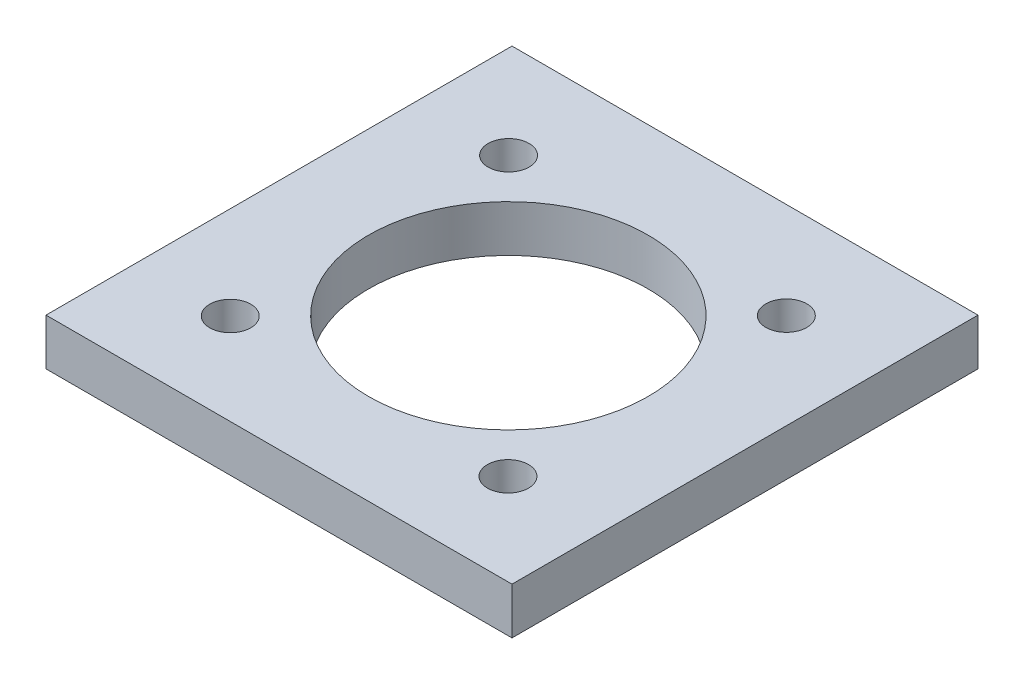
ISO-10303-21;
HEADER;
FILE_DESCRIPTION(('STEP AP214'),'2;1');
FILE_NAME('part.step','',(''),(''),'','','');
FILE_SCHEMA(('AUTOMOTIVE_DESIGN { 1 0 10303 214 1 1 1 1 }'));
ENDSEC;
DATA;
#1=APPLICATION_CONTEXT('core data for automotive mechanical design processes');
#2=APPLICATION_PROTOCOL_DEFINITION('international standard','automotive_design',2000,#1);
#3=PRODUCT_CONTEXT('',#1,'mechanical');
#4=PRODUCT('Part','Part','',(#3));
#5=PRODUCT_RELATED_PRODUCT_CATEGORY('part','',(#4));
#6=PRODUCT_DEFINITION_FORMATION('','',#4);
#7=PRODUCT_DEFINITION_CONTEXT('part definition',#1,'design');
#8=PRODUCT_DEFINITION('design','',#6,#7);
#9=PRODUCT_DEFINITION_SHAPE('','',#8);
#10=(LENGTH_UNIT() NAMED_UNIT(*) SI_UNIT(.MILLI.,.METRE.));
#11=(NAMED_UNIT(*) PLANE_ANGLE_UNIT() SI_UNIT($,.RADIAN.));
#12=(NAMED_UNIT(*) SI_UNIT($,.STERADIAN.) SOLID_ANGLE_UNIT());
#13=UNCERTAINTY_MEASURE_WITH_UNIT(LENGTH_MEASURE(1.E-05),#10,'distance_accuracy_value','');
#14=(GEOMETRIC_REPRESENTATION_CONTEXT(3) GLOBAL_UNCERTAINTY_ASSIGNED_CONTEXT((#13)) GLOBAL_UNIT_ASSIGNED_CONTEXT((#10,
#11,#12)) REPRESENTATION_CONTEXT('',''));
#15=CARTESIAN_POINT('',(0.,0.,0.));
#16=DIRECTION('',(0.,0.,1.));
#17=DIRECTION('',(1.,0.,0.));
#18=AXIS2_PLACEMENT_3D('',#15,#16,#17);
#19=CARTESIAN_POINT('',(0.,5.,0.));
#20=DIRECTION('',(0.,-1.,0.));
#21=DIRECTION('',(0.,0.,-1.));
#22=AXIS2_PLACEMENT_3D('',#19,#20,#21);
#23=PLANE('',#22);
#24=CARTESIAN_POINT('',(14.7671997765636,5.,-14.6675996089863));
#25=DIRECTION('',(0.,1.,0.));
#26=DIRECTION('',(0.,0.,1.));
#27=AXIS2_PLACEMENT_3D('',#24,#25,#26);
#28=CIRCLE('',#27,2.19999999999998);
#29=CARTESIAN_POINT('',(14.7671997765636,5.,-12.4675996089864));
#30=VERTEX_POINT('',#29);
#31=EDGE_CURVE('E153',#30,#30,#28,.T.);
#32=ORIENTED_EDGE('',*,*,#31,.F.);
#33=EDGE_LOOP('',(#32));
#34=FACE_BOUND('',#33,.T.);
#35=CARTESIAN_POINT('',(-15.0328002234364,5.,15.1988005027319));
#36=DIRECTION('',(0.,1.,0.));
#37=DIRECTION('',(0.,0.,1.));
#38=AXIS2_PLACEMENT_3D('',#35,#36,#37);
#39=CIRCLE('',#38,2.2);
#40=CARTESIAN_POINT('',(-15.0328002234364,5.,17.3988005027319));
#41=VERTEX_POINT('',#40);
#42=EDGE_CURVE('E160',#41,#41,#39,.T.);
#43=ORIENTED_EDGE('',*,*,#42,.F.);
#44=EDGE_LOOP('',(#43));
#45=FACE_BOUND('',#44,.T.);
#46=CARTESIAN_POINT('',(-0.132800223436359,5.,0.260912254546837));
#47=DIRECTION('',(0.,1.,0.));
#48=DIRECTION('',(0.,0.,1.));
#49=AXIS2_PLACEMENT_3D('',#46,#47,#48);
#50=CIRCLE('',#49,15.);
#51=CARTESIAN_POINT('',(-0.132800223436359,5.,15.2609122545468));
#52=VERTEX_POINT('',#51);
#53=EDGE_CURVE('E156',#52,#52,#50,.T.);
#54=ORIENTED_EDGE('',*,*,#53,.F.);
#55=EDGE_LOOP('',(#54));
#56=FACE_BOUND('',#55,.T.);
#57=DIRECTION('',(-1.,0.,0.));
#58=VECTOR('',#57,1.);
#59=CARTESIAN_POINT('',(25.,5.,-25.));
#60=LINE('',#59,#58);
#61=CARTESIAN_POINT('',(25.,5.,-25.));
#62=VERTEX_POINT('',#61);
#63=CARTESIAN_POINT('',(-25.,5.,-25.));
#64=VERTEX_POINT('',#63);
#65=EDGE_CURVE('E97',#62,#64,#60,.T.);
#66=ORIENTED_EDGE('',*,*,#65,.T.);
#67=DIRECTION('',(0.,0.,-1.));
#68=VECTOR('',#67,1.);
#69=CARTESIAN_POINT('',(-25.,5.,25.));
#70=LINE('',#69,#68);
#71=CARTESIAN_POINT('',(-25.,5.,25.));
#72=VERTEX_POINT('',#71);
#73=EDGE_CURVE('E104',#72,#64,#70,.T.);
#74=ORIENTED_EDGE('',*,*,#73,.F.);
#75=DIRECTION('',(-1.,0.,0.));
#76=VECTOR('',#75,1.);
#77=CARTESIAN_POINT('',(25.,5.,25.));
#78=LINE('',#77,#76);
#79=CARTESIAN_POINT('',(25.,5.,25.));
#80=VERTEX_POINT('',#79);
#81=EDGE_CURVE('E112',#80,#72,#78,.T.);
#82=ORIENTED_EDGE('',*,*,#81,.F.);
#83=DIRECTION('',(0.,0.,-1.));
#84=VECTOR('',#83,1.);
#85=CARTESIAN_POINT('',(25.,5.,25.));
#86=LINE('',#85,#84);
#87=EDGE_CURVE('E74',#80,#62,#86,.T.);
#88=ORIENTED_EDGE('',*,*,#87,.T.);
#89=EDGE_LOOP('',(#66,#74,#82,#88));
#90=FACE_BOUND('',#89,.T.);
#91=CARTESIAN_POINT('',(14.7671997765637,5.,15.1988005027319));
#92=DIRECTION('',(0.,-1.,0.));
#93=DIRECTION('',(0.,0.,-1.));
#94=AXIS2_PLACEMENT_3D('',#91,#92,#93);
#95=CIRCLE('',#94,2.19999999999999);
#96=CARTESIAN_POINT('',(14.7671997765637,5.,12.9988005027319));
#97=VERTEX_POINT('',#96);
#98=EDGE_CURVE('E142',#97,#97,#95,.T.);
#99=ORIENTED_EDGE('',*,*,#98,.T.);
#100=EDGE_LOOP('',(#99));
#101=FACE_BOUND('',#100,.T.);
#102=CARTESIAN_POINT('',(-15.0328002234364,5.,-14.6675996089863));
#103=DIRECTION('',(0.,-1.,0.));
#104=DIRECTION('',(0.,0.,-1.));
#105=AXIS2_PLACEMENT_3D('',#102,#103,#104);
#106=CIRCLE('',#105,2.19999999999999);
#107=CARTESIAN_POINT('',(-15.0328002234364,5.,-16.8675996089863));
#108=VERTEX_POINT('',#107);
#109=EDGE_CURVE('E141',#108,#108,#106,.T.);
#110=ORIENTED_EDGE('',*,*,#109,.T.);
#111=EDGE_LOOP('',(#110));
#112=FACE_BOUND('',#111,.T.);
#113=ADVANCED_FACE('F57',(#34,#45,#56,#90,#101,#112),#23,.F.);
#114=CARTESIAN_POINT('',(0.,0.,0.));
#115=DIRECTION('',(0.,-1.,0.));
#116=DIRECTION('',(0.,0.,-1.));
#117=AXIS2_PLACEMENT_3D('',#114,#115,#116);
#118=PLANE('',#117);
#119=CARTESIAN_POINT('',(14.7671997765636,0.,-14.6675996089863));
#120=DIRECTION('',(0.,1.,0.));
#121=DIRECTION('',(0.,0.,1.));
#122=AXIS2_PLACEMENT_3D('',#119,#120,#121);
#123=CIRCLE('',#122,2.19999999999998);
#124=CARTESIAN_POINT('',(14.7671997765636,0.,-12.4675996089864));
#125=VERTEX_POINT('',#124);
#126=EDGE_CURVE('E157',#125,#125,#123,.T.);
#127=ORIENTED_EDGE('',*,*,#126,.T.);
#128=EDGE_LOOP('',(#127));
#129=FACE_BOUND('',#128,.T.);
#130=CARTESIAN_POINT('',(-15.0328002234364,0.,15.1988005027319));
#131=DIRECTION('',(0.,1.,0.));
#132=DIRECTION('',(0.,0.,1.));
#133=AXIS2_PLACEMENT_3D('',#130,#131,#132);
#134=CIRCLE('',#133,2.2);
#135=CARTESIAN_POINT('',(-15.0328002234364,0.,17.3988005027319));
#136=VERTEX_POINT('',#135);
#137=EDGE_CURVE('E145',#136,#136,#134,.T.);
#138=ORIENTED_EDGE('',*,*,#137,.T.);
#139=EDGE_LOOP('',(#138));
#140=FACE_BOUND('',#139,.T.);
#141=CARTESIAN_POINT('',(14.7671997765637,0.,15.1988005027319));
#142=DIRECTION('',(0.,-1.,0.));
#143=DIRECTION('',(0.,0.,-1.));
#144=AXIS2_PLACEMENT_3D('',#141,#142,#143);
#145=CIRCLE('',#144,2.19999999999999);
#146=CARTESIAN_POINT('',(14.7671997765637,0.,12.9988005027319));
#147=VERTEX_POINT('',#146);
#148=EDGE_CURVE('E148',#147,#147,#145,.T.);
#149=ORIENTED_EDGE('',*,*,#148,.F.);
#150=EDGE_LOOP('',(#149));
#151=FACE_BOUND('',#150,.T.);
#152=CARTESIAN_POINT('',(-0.132800223436359,0.,0.260912254546837));
#153=DIRECTION('',(0.,1.,0.));
#154=DIRECTION('',(0.,0.,1.));
#155=AXIS2_PLACEMENT_3D('',#152,#153,#154);
#156=CIRCLE('',#155,15.);
#157=CARTESIAN_POINT('',(-0.132800223436359,0.,15.2609122545468));
#158=VERTEX_POINT('',#157);
#159=EDGE_CURVE('E123',#158,#158,#156,.T.);
#160=ORIENTED_EDGE('',*,*,#159,.T.);
#161=EDGE_LOOP('',(#160));
#162=FACE_BOUND('',#161,.T.);
#163=DIRECTION('',(-1.,0.,0.));
#164=VECTOR('',#163,1.);
#165=CARTESIAN_POINT('',(25.,0.,-25.));
#166=LINE('',#165,#164);
#167=CARTESIAN_POINT('',(25.,0.,-25.));
#168=VERTEX_POINT('',#167);
#169=CARTESIAN_POINT('',(-25.,0.,-25.));
#170=VERTEX_POINT('',#169);
#171=EDGE_CURVE('E120',#168,#170,#166,.T.);
#172=ORIENTED_EDGE('',*,*,#171,.F.);
#173=DIRECTION('',(0.,0.,-1.));
#174=VECTOR('',#173,1.);
#175=CARTESIAN_POINT('',(25.,0.,25.));
#176=LINE('',#175,#174);
#177=CARTESIAN_POINT('',(25.,0.,25.));
#178=VERTEX_POINT('',#177);
#179=EDGE_CURVE('E92',#178,#168,#176,.T.);
#180=ORIENTED_EDGE('',*,*,#179,.F.);
#181=DIRECTION('',(-1.,0.,0.));
#182=VECTOR('',#181,1.);
#183=CARTESIAN_POINT('',(25.,0.,25.));
#184=LINE('',#183,#182);
#185=CARTESIAN_POINT('',(-25.,0.,25.));
#186=VERTEX_POINT('',#185);
#187=EDGE_CURVE('E125',#178,#186,#184,.T.);
#188=ORIENTED_EDGE('',*,*,#187,.T.);
#189=DIRECTION('',(0.,0.,-1.));
#190=VECTOR('',#189,1.);
#191=CARTESIAN_POINT('',(-25.,0.,25.));
#192=LINE('',#191,#190);
#193=EDGE_CURVE('E106',#186,#170,#192,.T.);
#194=ORIENTED_EDGE('',*,*,#193,.T.);
#195=EDGE_LOOP('',(#172,#180,#188,#194));
#196=FACE_BOUND('',#195,.T.);
#197=CARTESIAN_POINT('',(-15.0328002234364,0.,-14.6675996089863));
#198=DIRECTION('',(0.,-1.,0.));
#199=DIRECTION('',(0.,0.,-1.));
#200=AXIS2_PLACEMENT_3D('',#197,#198,#199);
#201=CIRCLE('',#200,2.19999999999999);
#202=CARTESIAN_POINT('',(-15.0328002234364,0.,-16.8675996089863));
#203=VERTEX_POINT('',#202);
#204=EDGE_CURVE('E139',#203,#203,#201,.T.);
#205=ORIENTED_EDGE('',*,*,#204,.F.);
#206=EDGE_LOOP('',(#205));
#207=FACE_BOUND('',#206,.T.);
#208=ADVANCED_FACE('F132',(#129,#140,#151,#162,#196,#207),#118,.T.);
#209=CARTESIAN_POINT('',(25.,5.,-25.));
#210=DIRECTION('',(0.,0.,1.));
#211=DIRECTION('',(1.,0.,0.));
#212=AXIS2_PLACEMENT_3D('',#209,#210,#211);
#213=PLANE('',#212);
#214=ORIENTED_EDGE('',*,*,#171,.T.);
#215=DIRECTION('',(0.,-1.,0.));
#216=VECTOR('',#215,1.);
#217=CARTESIAN_POINT('',(-25.,5.,-25.));
#218=LINE('',#217,#216);
#219=EDGE_CURVE('E12',#64,#170,#218,.T.);
#220=ORIENTED_EDGE('',*,*,#219,.F.);
#221=ORIENTED_EDGE('',*,*,#65,.F.);
#222=DIRECTION('',(0.,-1.,0.));
#223=VECTOR('',#222,1.);
#224=CARTESIAN_POINT('',(25.,5.,-25.));
#225=LINE('',#224,#223);
#226=EDGE_CURVE('E116',#62,#168,#225,.T.);
#227=ORIENTED_EDGE('',*,*,#226,.T.);
#228=EDGE_LOOP('',(#214,#220,#221,#227));
#229=FACE_BOUND('',#228,.T.);
#230=ADVANCED_FACE('F59',(#229),#213,.F.);
#231=CARTESIAN_POINT('',(-25.,5.,25.));
#232=DIRECTION('',(-1.,0.,0.));
#233=DIRECTION('',(0.,0.,1.));
#234=AXIS2_PLACEMENT_3D('',#231,#232,#233);
#235=PLANE('',#234);
#236=ORIENTED_EDGE('',*,*,#193,.F.);
#237=DIRECTION('',(0.,-1.,0.));
#238=VECTOR('',#237,1.);
#239=CARTESIAN_POINT('',(-25.,5.,25.));
#240=LINE('',#239,#238);
#241=EDGE_CURVE('E66',#72,#186,#240,.T.);
#242=ORIENTED_EDGE('',*,*,#241,.F.);
#243=ORIENTED_EDGE('',*,*,#73,.T.);
#244=ORIENTED_EDGE('',*,*,#219,.T.);
#245=EDGE_LOOP('',(#236,#242,#243,#244));
#246=FACE_BOUND('',#245,.T.);
#247=ADVANCED_FACE('F103',(#246),#235,.T.);
#248=CARTESIAN_POINT('',(25.,5.,25.));
#249=DIRECTION('',(0.,0.,1.));
#250=DIRECTION('',(1.,0.,0.));
#251=AXIS2_PLACEMENT_3D('',#248,#249,#250);
#252=PLANE('',#251);
#253=ORIENTED_EDGE('',*,*,#187,.F.);
#254=DIRECTION('',(0.,-1.,0.));
#255=VECTOR('',#254,1.);
#256=CARTESIAN_POINT('',(25.,5.,25.));
#257=LINE('',#256,#255);
#258=EDGE_CURVE('E89',#80,#178,#257,.T.);
#259=ORIENTED_EDGE('',*,*,#258,.F.);
#260=ORIENTED_EDGE('',*,*,#81,.T.);
#261=ORIENTED_EDGE('',*,*,#241,.T.);
#262=EDGE_LOOP('',(#253,#259,#260,#261));
#263=FACE_BOUND('',#262,.T.);
#264=ADVANCED_FACE('F114',(#263),#252,.T.);
#265=CARTESIAN_POINT('',(25.,5.,25.));
#266=DIRECTION('',(-1.,0.,0.));
#267=DIRECTION('',(0.,0.,1.));
#268=AXIS2_PLACEMENT_3D('',#265,#266,#267);
#269=PLANE('',#268);
#270=ORIENTED_EDGE('',*,*,#179,.T.);
#271=ORIENTED_EDGE('',*,*,#226,.F.);
#272=ORIENTED_EDGE('',*,*,#87,.F.);
#273=ORIENTED_EDGE('',*,*,#258,.T.);
#274=EDGE_LOOP('',(#270,#271,#272,#273));
#275=FACE_BOUND('',#274,.T.);
#276=ADVANCED_FACE('F182',(#275),#269,.F.);
#277=CARTESIAN_POINT('',(-0.132800223436359,0.,0.260912254546837));
#278=DIRECTION('',(0.,1.,0.));
#279=DIRECTION('',(0.,0.,1.));
#280=AXIS2_PLACEMENT_3D('',#277,#278,#279);
#281=CYLINDRICAL_SURFACE('',#280,15.);
#282=ORIENTED_EDGE('',*,*,#159,.F.);
#283=EDGE_LOOP('',(#282));
#284=FACE_BOUND('',#283,.T.);
#285=ORIENTED_EDGE('',*,*,#53,.T.);
#286=EDGE_LOOP('',(#285));
#287=FACE_BOUND('',#286,.T.);
#288=ADVANCED_FACE('F170',(#284,#287),#281,.F.);
#289=CARTESIAN_POINT('',(14.7671997765637,0.,15.1988005027319));
#290=DIRECTION('',(0.,1.,0.));
#291=DIRECTION('',(0.,0.,1.));
#292=AXIS2_PLACEMENT_3D('',#289,#290,#291);
#293=CYLINDRICAL_SURFACE('',#292,2.19999999999999);
#294=ORIENTED_EDGE('',*,*,#148,.T.);
#295=EDGE_LOOP('',(#294));
#296=FACE_BOUND('',#295,.T.);
#297=ORIENTED_EDGE('',*,*,#98,.F.);
#298=EDGE_LOOP('',(#297));
#299=FACE_BOUND('',#298,.T.);
#300=ADVANCED_FACE('F209',(#296,#299),#293,.F.);
#301=CARTESIAN_POINT('',(-15.0328002234364,0.,-14.6675996089863));
#302=DIRECTION('',(0.,1.,0.));
#303=DIRECTION('',(0.,0.,1.));
#304=AXIS2_PLACEMENT_3D('',#301,#302,#303);
#305=CYLINDRICAL_SURFACE('',#304,2.19999999999999);
#306=ORIENTED_EDGE('',*,*,#204,.T.);
#307=EDGE_LOOP('',(#306));
#308=FACE_BOUND('',#307,.T.);
#309=ORIENTED_EDGE('',*,*,#109,.F.);
#310=EDGE_LOOP('',(#309));
#311=FACE_BOUND('',#310,.T.);
#312=ADVANCED_FACE('F218',(#308,#311),#305,.F.);
#313=CARTESIAN_POINT('',(-15.0328002234364,0.,15.1988005027319));
#314=DIRECTION('',(0.,1.,0.));
#315=DIRECTION('',(0.,0.,1.));
#316=AXIS2_PLACEMENT_3D('',#313,#314,#315);
#317=CYLINDRICAL_SURFACE('',#316,2.2);
#318=ORIENTED_EDGE('',*,*,#137,.F.);
#319=EDGE_LOOP('',(#318));
#320=FACE_BOUND('',#319,.T.);
#321=ORIENTED_EDGE('',*,*,#42,.T.);
#322=EDGE_LOOP('',(#321));
#323=FACE_BOUND('',#322,.T.);
#324=ADVANCED_FACE('F228',(#320,#323),#317,.F.);
#325=CARTESIAN_POINT('',(14.7671997765636,0.,-14.6675996089863));
#326=DIRECTION('',(0.,1.,0.));
#327=DIRECTION('',(0.,0.,1.));
#328=AXIS2_PLACEMENT_3D('',#325,#326,#327);
#329=CYLINDRICAL_SURFACE('',#328,2.19999999999998);
#330=ORIENTED_EDGE('',*,*,#126,.F.);
#331=EDGE_LOOP('',(#330));
#332=FACE_BOUND('',#331,.T.);
#333=ORIENTED_EDGE('',*,*,#31,.T.);
#334=EDGE_LOOP('',(#333));
#335=FACE_BOUND('',#334,.T.);
#336=ADVANCED_FACE('F237',(#332,#335),#329,.F.);
#337=CLOSED_SHELL('',(#113,#208,#230,#247,#264,#276,#288,#300,#312,#324,#336));
#338=MANIFOLD_SOLID_BREP('B2',#337);
#339=ADVANCED_BREP_SHAPE_REPRESENTATION('',(#18,#338),#14);
#340=SHAPE_DEFINITION_REPRESENTATION(#9,#339);
ENDSEC;
END-ISO-10303-21;
